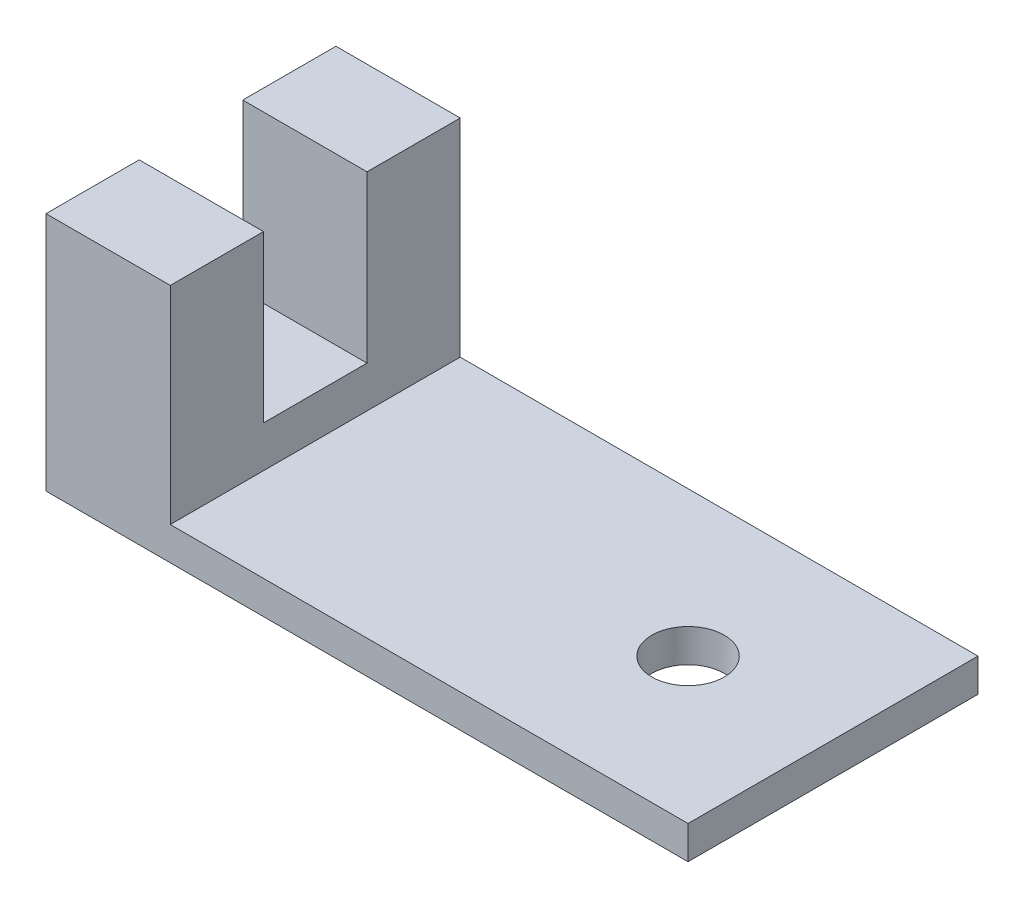
ISO-10303-21;
HEADER;
FILE_DESCRIPTION(('STEP AP214'),'2;1');
FILE_NAME('part.step','',(''),(''),'','','');
FILE_SCHEMA(('AUTOMOTIVE_DESIGN { 1 0 10303 214 1 1 1 1 }'));
ENDSEC;
DATA;
#1=APPLICATION_CONTEXT('core data for automotive mechanical design processes');
#2=APPLICATION_PROTOCOL_DEFINITION('international standard','automotive_design',2000,#1);
#3=PRODUCT_CONTEXT('',#1,'mechanical');
#4=PRODUCT('Part','Part','',(#3));
#5=PRODUCT_RELATED_PRODUCT_CATEGORY('part','',(#4));
#6=PRODUCT_DEFINITION_FORMATION('','',#4);
#7=PRODUCT_DEFINITION_CONTEXT('part definition',#1,'design');
#8=PRODUCT_DEFINITION('design','',#6,#7);
#9=PRODUCT_DEFINITION_SHAPE('','',#8);
#10=(LENGTH_UNIT() NAMED_UNIT(*) SI_UNIT(.MILLI.,.METRE.));
#11=(NAMED_UNIT(*) PLANE_ANGLE_UNIT() SI_UNIT($,.RADIAN.));
#12=(NAMED_UNIT(*) SI_UNIT($,.STERADIAN.) SOLID_ANGLE_UNIT());
#13=UNCERTAINTY_MEASURE_WITH_UNIT(LENGTH_MEASURE(1.E-05),#10,'distance_accuracy_value','');
#14=(GEOMETRIC_REPRESENTATION_CONTEXT(3) GLOBAL_UNCERTAINTY_ASSIGNED_CONTEXT((#13)) GLOBAL_UNIT_ASSIGNED_CONTEXT((#10,
#11,#12)) REPRESENTATION_CONTEXT('',''));
#15=CARTESIAN_POINT('',(0.,0.,0.));
#16=DIRECTION('',(0.,0.,1.));
#17=DIRECTION('',(1.,0.,0.));
#18=AXIS2_PLACEMENT_3D('',#15,#16,#17);
#19=CARTESIAN_POINT('',(0.,1.6,0.));
#20=DIRECTION('',(1.,0.,0.));
#21=DIRECTION('',(0.,0.,-1.));
#22=AXIS2_PLACEMENT_3D('',#19,#20,#21);
#23=PLANE('',#22);
#24=DIRECTION('',(0.,0.,1.));
#25=VECTOR('',#24,1.);
#26=CARTESIAN_POINT('',(0.,0.,0.));
#27=LINE('',#26,#25);
#28=CARTESIAN_POINT('',(0.,0.,-14.));
#29=VERTEX_POINT('',#28);
#30=CARTESIAN_POINT('',(0.,0.,0.));
#31=VERTEX_POINT('',#30);
#32=EDGE_CURVE('E99',#29,#31,#27,.T.);
#33=ORIENTED_EDGE('',*,*,#32,.T.);
#34=DIRECTION('',(0.,-1.,0.));
#35=VECTOR('',#34,1.);
#36=CARTESIAN_POINT('',(0.,1.6,0.));
#37=LINE('',#36,#35);
#38=CARTESIAN_POINT('',(0.,11.6,0.));
#39=VERTEX_POINT('',#38);
#40=EDGE_CURVE('E11',#39,#31,#37,.T.);
#41=ORIENTED_EDGE('',*,*,#40,.F.);
#42=DIRECTION('',(0.,0.,-1.));
#43=VECTOR('',#42,1.);
#44=CARTESIAN_POINT('',(0.,11.6,-4.5));
#45=LINE('',#44,#43);
#46=CARTESIAN_POINT('',(0.,11.6,-4.5));
#47=VERTEX_POINT('',#46);
#48=EDGE_CURVE('E131',#39,#47,#45,.T.);
#49=ORIENTED_EDGE('',*,*,#48,.T.);
#50=DIRECTION('',(0.,-1.,0.));
#51=VECTOR('',#50,1.);
#52=CARTESIAN_POINT('',(0.,3.6,-4.5));
#53=LINE('',#52,#51);
#54=CARTESIAN_POINT('',(0.,3.6,-4.5));
#55=VERTEX_POINT('',#54);
#56=EDGE_CURVE('E190',#47,#55,#53,.T.);
#57=ORIENTED_EDGE('',*,*,#56,.T.);
#58=DIRECTION('',(0.,0.,-1.));
#59=VECTOR('',#58,1.);
#60=CARTESIAN_POINT('',(0.,3.6,-9.5));
#61=LINE('',#60,#59);
#62=CARTESIAN_POINT('',(0.,3.6,-9.5));
#63=VERTEX_POINT('',#62);
#64=EDGE_CURVE('E187',#55,#63,#61,.T.);
#65=ORIENTED_EDGE('',*,*,#64,.T.);
#66=DIRECTION('',(0.,1.,0.));
#67=VECTOR('',#66,1.);
#68=CARTESIAN_POINT('',(0.,11.6,-9.5));
#69=LINE('',#68,#67);
#70=CARTESIAN_POINT('',(0.,11.6,-9.5));
#71=VERTEX_POINT('',#70);
#72=EDGE_CURVE('E185',#63,#71,#69,.T.);
#73=ORIENTED_EDGE('',*,*,#72,.T.);
#74=DIRECTION('',(0.,0.,-1.));
#75=VECTOR('',#74,1.);
#76=CARTESIAN_POINT('',(0.,11.6,-14.));
#77=LINE('',#76,#75);
#78=CARTESIAN_POINT('',(0.,11.6,-14.));
#79=VERTEX_POINT('',#78);
#80=EDGE_CURVE('E102',#71,#79,#77,.T.);
#81=ORIENTED_EDGE('',*,*,#80,.T.);
#82=DIRECTION('',(0.,-1.,0.));
#83=VECTOR('',#82,1.);
#84=CARTESIAN_POINT('',(0.,1.6,-14.));
#85=LINE('',#84,#83);
#86=EDGE_CURVE('E85',#79,#29,#85,.T.);
#87=ORIENTED_EDGE('',*,*,#86,.T.);
#88=EDGE_LOOP('',(#33,#41,#49,#57,#65,#73,#81,#87));
#89=FACE_BOUND('',#88,.T.);
#90=ADVANCED_FACE('F37',(#89),#23,.F.);
#91=CARTESIAN_POINT('',(0.,1.6,0.));
#92=DIRECTION('',(0.,0.,-1.));
#93=DIRECTION('',(-1.,0.,0.));
#94=AXIS2_PLACEMENT_3D('',#91,#92,#93);
#95=PLANE('',#94);
#96=DIRECTION('',(1.,0.,0.));
#97=VECTOR('',#96,1.);
#98=CARTESIAN_POINT('',(0.,0.,0.));
#99=LINE('',#98,#97);
#100=CARTESIAN_POINT('',(31.,0.,0.));
#101=VERTEX_POINT('',#100);
#102=EDGE_CURVE('E106',#31,#101,#99,.T.);
#103=ORIENTED_EDGE('',*,*,#102,.T.);
#104=DIRECTION('',(0.,-1.,0.));
#105=VECTOR('',#104,1.);
#106=CARTESIAN_POINT('',(31.,1.6,0.));
#107=LINE('',#106,#105);
#108=CARTESIAN_POINT('',(31.,1.6,0.));
#109=VERTEX_POINT('',#108);
#110=EDGE_CURVE('E44',#109,#101,#107,.T.);
#111=ORIENTED_EDGE('',*,*,#110,.F.);
#112=DIRECTION('',(1.,0.,0.));
#113=VECTOR('',#112,1.);
#114=CARTESIAN_POINT('',(0.,1.6,0.));
#115=LINE('',#114,#113);
#116=CARTESIAN_POINT('',(6.,1.6,0.));
#117=VERTEX_POINT('',#116);
#118=EDGE_CURVE('E92',#117,#109,#115,.T.);
#119=ORIENTED_EDGE('',*,*,#118,.F.);
#120=DIRECTION('',(0.,1.,0.));
#121=VECTOR('',#120,1.);
#122=CARTESIAN_POINT('',(6.,11.6,0.));
#123=LINE('',#122,#121);
#124=CARTESIAN_POINT('',(6.,11.6,0.));
#125=VERTEX_POINT('',#124);
#126=EDGE_CURVE('E51',#117,#125,#123,.T.);
#127=ORIENTED_EDGE('',*,*,#126,.T.);
#128=DIRECTION('',(-1.,0.,0.));
#129=VECTOR('',#128,1.);
#130=CARTESIAN_POINT('',(6.,11.6,0.));
#131=LINE('',#130,#129);
#132=EDGE_CURVE('E126',#125,#39,#131,.T.);
#133=ORIENTED_EDGE('',*,*,#132,.T.);
#134=ORIENTED_EDGE('',*,*,#40,.T.);
#135=EDGE_LOOP('',(#103,#111,#119,#127,#133,#134));
#136=FACE_BOUND('',#135,.T.);
#137=ADVANCED_FACE('F122',(#136),#95,.F.);
#138=CARTESIAN_POINT('',(31.,1.6,0.));
#139=DIRECTION('',(-1.,0.,0.));
#140=DIRECTION('',(0.,0.,1.));
#141=AXIS2_PLACEMENT_3D('',#138,#139,#140);
#142=PLANE('',#141);
#143=DIRECTION('',(0.,0.,-1.));
#144=VECTOR('',#143,1.);
#145=CARTESIAN_POINT('',(31.,0.,0.));
#146=LINE('',#145,#144);
#147=CARTESIAN_POINT('',(31.,0.,-14.));
#148=VERTEX_POINT('',#147);
#149=EDGE_CURVE('E93',#101,#148,#146,.T.);
#150=ORIENTED_EDGE('',*,*,#149,.T.);
#151=DIRECTION('',(0.,-1.,0.));
#152=VECTOR('',#151,1.);
#153=CARTESIAN_POINT('',(31.,1.6,-14.));
#154=LINE('',#153,#152);
#155=CARTESIAN_POINT('',(31.,1.6,-14.));
#156=VERTEX_POINT('',#155);
#157=EDGE_CURVE('E88',#156,#148,#154,.T.);
#158=ORIENTED_EDGE('',*,*,#157,.F.);
#159=DIRECTION('',(0.,0.,-1.));
#160=VECTOR('',#159,1.);
#161=CARTESIAN_POINT('',(31.,1.6,0.));
#162=LINE('',#161,#160);
#163=EDGE_CURVE('E60',#109,#156,#162,.T.);
#164=ORIENTED_EDGE('',*,*,#163,.F.);
#165=ORIENTED_EDGE('',*,*,#110,.T.);
#166=EDGE_LOOP('',(#150,#158,#164,#165));
#167=FACE_BOUND('',#166,.T.);
#168=ADVANCED_FACE('F119',(#167),#142,.F.);
#169=CARTESIAN_POINT('',(0.,1.6,-14.));
#170=DIRECTION('',(0.,0.,1.));
#171=DIRECTION('',(1.,0.,0.));
#172=AXIS2_PLACEMENT_3D('',#169,#170,#171);
#173=PLANE('',#172);
#174=DIRECTION('',(-1.,0.,0.));
#175=VECTOR('',#174,1.);
#176=CARTESIAN_POINT('',(0.,0.,-14.));
#177=LINE('',#176,#175);
#178=EDGE_CURVE('E80',#148,#29,#177,.T.);
#179=ORIENTED_EDGE('',*,*,#178,.T.);
#180=ORIENTED_EDGE('',*,*,#86,.F.);
#181=DIRECTION('',(-1.,0.,0.));
#182=VECTOR('',#181,1.);
#183=CARTESIAN_POINT('',(6.,11.6,-14.));
#184=LINE('',#183,#182);
#185=CARTESIAN_POINT('',(6.,11.6,-14.));
#186=VERTEX_POINT('',#185);
#187=EDGE_CURVE('E107',#186,#79,#184,.T.);
#188=ORIENTED_EDGE('',*,*,#187,.F.);
#189=DIRECTION('',(0.,-1.,0.));
#190=VECTOR('',#189,1.);
#191=CARTESIAN_POINT('',(6.,1.6,-14.));
#192=LINE('',#191,#190);
#193=CARTESIAN_POINT('',(6.,1.6,-14.));
#194=VERTEX_POINT('',#193);
#195=EDGE_CURVE('E169',#186,#194,#192,.T.);
#196=ORIENTED_EDGE('',*,*,#195,.T.);
#197=DIRECTION('',(-1.,0.,0.));
#198=VECTOR('',#197,1.);
#199=CARTESIAN_POINT('',(0.,1.6,-14.));
#200=LINE('',#199,#198);
#201=EDGE_CURVE('E103',#156,#194,#200,.T.);
#202=ORIENTED_EDGE('',*,*,#201,.F.);
#203=ORIENTED_EDGE('',*,*,#157,.T.);
#204=EDGE_LOOP('',(#179,#180,#188,#196,#202,#203));
#205=FACE_BOUND('',#204,.T.);
#206=ADVANCED_FACE('F82',(#205),#173,.F.);
#207=CARTESIAN_POINT('',(0.,1.6,0.));
#208=DIRECTION('',(0.,-1.,0.));
#209=DIRECTION('',(0.,0.,-1.));
#210=AXIS2_PLACEMENT_3D('',#207,#208,#209);
#211=PLANE('',#210);
#212=CARTESIAN_POINT('',(24.,1.6,-7.));
#213=DIRECTION('',(0.,1.,0.));
#214=DIRECTION('',(0.,0.,1.));
#215=AXIS2_PLACEMENT_3D('',#212,#213,#214);
#216=CIRCLE('',#215,1.75);
#217=CARTESIAN_POINT('',(24.,1.6,-5.25));
#218=VERTEX_POINT('',#217);
#219=EDGE_CURVE('E192',#218,#218,#216,.T.);
#220=ORIENTED_EDGE('',*,*,#219,.F.);
#221=EDGE_LOOP('',(#220));
#222=FACE_BOUND('',#221,.T.);
#223=ORIENTED_EDGE('',*,*,#201,.T.);
#224=DIRECTION('',(0.,0.,1.));
#225=VECTOR('',#224,1.);
#226=CARTESIAN_POINT('',(6.,1.6,0.));
#227=LINE('',#226,#225);
#228=EDGE_CURVE('E166',#194,#117,#227,.T.);
#229=ORIENTED_EDGE('',*,*,#228,.T.);
#230=ORIENTED_EDGE('',*,*,#118,.T.);
#231=ORIENTED_EDGE('',*,*,#163,.T.);
#232=EDGE_LOOP('',(#223,#229,#230,#231));
#233=FACE_BOUND('',#232,.T.);
#234=ADVANCED_FACE('F173',(#222,#233),#211,.F.);
#235=CARTESIAN_POINT('',(0.,0.,0.));
#236=DIRECTION('',(0.,-1.,0.));
#237=DIRECTION('',(0.,0.,-1.));
#238=AXIS2_PLACEMENT_3D('',#235,#236,#237);
#239=PLANE('',#238);
#240=CARTESIAN_POINT('',(24.,0.,-7.));
#241=DIRECTION('',(0.,-1.,0.));
#242=DIRECTION('',(0.,0.,-1.));
#243=AXIS2_PLACEMENT_3D('',#240,#241,#242);
#244=CIRCLE('',#243,1.75);
#245=CARTESIAN_POINT('',(24.,0.,-8.75));
#246=VERTEX_POINT('',#245);
#247=EDGE_CURVE('E207',#246,#246,#244,.F.);
#248=ORIENTED_EDGE('',*,*,#247,.T.);
#249=EDGE_LOOP('',(#248));
#250=FACE_BOUND('',#249,.T.);
#251=ORIENTED_EDGE('',*,*,#32,.F.);
#252=ORIENTED_EDGE('',*,*,#178,.F.);
#253=ORIENTED_EDGE('',*,*,#149,.F.);
#254=ORIENTED_EDGE('',*,*,#102,.F.);
#255=EDGE_LOOP('',(#251,#252,#253,#254));
#256=FACE_BOUND('',#255,.T.);
#257=ADVANCED_FACE('F105',(#250,#256),#239,.T.);
#258=CARTESIAN_POINT('',(6.,11.6,-14.));
#259=DIRECTION('',(0.,1.,0.));
#260=DIRECTION('',(0.,0.,1.));
#261=AXIS2_PLACEMENT_3D('',#258,#259,#260);
#262=PLANE('',#261);
#263=ORIENTED_EDGE('',*,*,#80,.F.);
#264=DIRECTION('',(-1.,0.,0.));
#265=VECTOR('',#264,1.);
#266=CARTESIAN_POINT('',(6.,11.6,-9.5));
#267=LINE('',#266,#265);
#268=CARTESIAN_POINT('',(6.,11.6,-9.5));
#269=VERTEX_POINT('',#268);
#270=EDGE_CURVE('E110',#269,#71,#267,.T.);
#271=ORIENTED_EDGE('',*,*,#270,.F.);
#272=DIRECTION('',(0.,0.,-1.));
#273=VECTOR('',#272,1.);
#274=CARTESIAN_POINT('',(6.,11.6,-14.));
#275=LINE('',#274,#273);
#276=EDGE_CURVE('E171',#269,#186,#275,.T.);
#277=ORIENTED_EDGE('',*,*,#276,.T.);
#278=ORIENTED_EDGE('',*,*,#187,.T.);
#279=EDGE_LOOP('',(#263,#271,#277,#278));
#280=FACE_BOUND('',#279,.T.);
#281=ADVANCED_FACE('F221',(#280),#262,.T.);
#282=CARTESIAN_POINT('',(6.,11.6,-9.5));
#283=DIRECTION('',(0.,0.,1.));
#284=DIRECTION('',(0.,-1.,0.));
#285=AXIS2_PLACEMENT_3D('',#282,#283,#284);
#286=PLANE('',#285);
#287=ORIENTED_EDGE('',*,*,#72,.F.);
#288=DIRECTION('',(-1.,0.,0.));
#289=VECTOR('',#288,1.);
#290=CARTESIAN_POINT('',(6.,3.6,-9.5));
#291=LINE('',#290,#289);
#292=CARTESIAN_POINT('',(6.,3.6,-9.5));
#293=VERTEX_POINT('',#292);
#294=EDGE_CURVE('E181',#293,#63,#291,.T.);
#295=ORIENTED_EDGE('',*,*,#294,.F.);
#296=DIRECTION('',(0.,1.,0.));
#297=VECTOR('',#296,1.);
#298=CARTESIAN_POINT('',(6.,11.6,-9.5));
#299=LINE('',#298,#297);
#300=EDGE_CURVE('E195',#293,#269,#299,.T.);
#301=ORIENTED_EDGE('',*,*,#300,.T.);
#302=ORIENTED_EDGE('',*,*,#270,.T.);
#303=EDGE_LOOP('',(#287,#295,#301,#302));
#304=FACE_BOUND('',#303,.T.);
#305=ADVANCED_FACE('F252',(#304),#286,.T.);
#306=CARTESIAN_POINT('',(6.,3.6,-9.5));
#307=DIRECTION('',(0.,1.,0.));
#308=DIRECTION('',(0.,0.,1.));
#309=AXIS2_PLACEMENT_3D('',#306,#307,#308);
#310=PLANE('',#309);
#311=ORIENTED_EDGE('',*,*,#64,.F.);
#312=DIRECTION('',(-1.,0.,0.));
#313=VECTOR('',#312,1.);
#314=CARTESIAN_POINT('',(6.,3.6,-4.5));
#315=LINE('',#314,#313);
#316=CARTESIAN_POINT('',(6.,3.6,-4.5));
#317=VERTEX_POINT('',#316);
#318=EDGE_CURVE('E179',#317,#55,#315,.T.);
#319=ORIENTED_EDGE('',*,*,#318,.F.);
#320=DIRECTION('',(0.,0.,-1.));
#321=VECTOR('',#320,1.);
#322=CARTESIAN_POINT('',(6.,3.6,-9.5));
#323=LINE('',#322,#321);
#324=EDGE_CURVE('E198',#317,#293,#323,.T.);
#325=ORIENTED_EDGE('',*,*,#324,.T.);
#326=ORIENTED_EDGE('',*,*,#294,.T.);
#327=EDGE_LOOP('',(#311,#319,#325,#326));
#328=FACE_BOUND('',#327,.T.);
#329=ADVANCED_FACE('F263',(#328),#310,.T.);
#330=CARTESIAN_POINT('',(6.,3.6,-4.5));
#331=DIRECTION('',(0.,0.,-1.));
#332=DIRECTION('',(-1.,0.,0.));
#333=AXIS2_PLACEMENT_3D('',#330,#331,#332);
#334=PLANE('',#333);
#335=ORIENTED_EDGE('',*,*,#56,.F.);
#336=DIRECTION('',(-1.,0.,0.));
#337=VECTOR('',#336,1.);
#338=CARTESIAN_POINT('',(6.,11.6,-4.5));
#339=LINE('',#338,#337);
#340=CARTESIAN_POINT('',(6.,11.6,-4.5));
#341=VERTEX_POINT('',#340);
#342=EDGE_CURVE('E177',#341,#47,#339,.T.);
#343=ORIENTED_EDGE('',*,*,#342,.F.);
#344=DIRECTION('',(0.,-1.,0.));
#345=VECTOR('',#344,1.);
#346=CARTESIAN_POINT('',(6.,3.6,-4.5));
#347=LINE('',#346,#345);
#348=EDGE_CURVE('E201',#341,#317,#347,.T.);
#349=ORIENTED_EDGE('',*,*,#348,.T.);
#350=ORIENTED_EDGE('',*,*,#318,.T.);
#351=EDGE_LOOP('',(#335,#343,#349,#350));
#352=FACE_BOUND('',#351,.T.);
#353=ADVANCED_FACE('F274',(#352),#334,.T.);
#354=CARTESIAN_POINT('',(6.,11.6,-4.5));
#355=DIRECTION('',(0.,1.,0.));
#356=DIRECTION('',(0.,0.,1.));
#357=AXIS2_PLACEMENT_3D('',#354,#355,#356);
#358=PLANE('',#357);
#359=ORIENTED_EDGE('',*,*,#48,.F.);
#360=ORIENTED_EDGE('',*,*,#132,.F.);
#361=DIRECTION('',(0.,0.,-1.));
#362=VECTOR('',#361,1.);
#363=CARTESIAN_POINT('',(6.,11.6,-4.5));
#364=LINE('',#363,#362);
#365=EDGE_CURVE('E204',#125,#341,#364,.T.);
#366=ORIENTED_EDGE('',*,*,#365,.T.);
#367=ORIENTED_EDGE('',*,*,#342,.T.);
#368=EDGE_LOOP('',(#359,#360,#366,#367));
#369=FACE_BOUND('',#368,.T.);
#370=ADVANCED_FACE('F285',(#369),#358,.T.);
#371=CARTESIAN_POINT('',(6.,0.,0.));
#372=DIRECTION('',(1.,0.,0.));
#373=DIRECTION('',(0.,0.,-1.));
#374=AXIS2_PLACEMENT_3D('',#371,#372,#373);
#375=PLANE('',#374);
#376=ORIENTED_EDGE('',*,*,#228,.F.);
#377=ORIENTED_EDGE('',*,*,#195,.F.);
#378=ORIENTED_EDGE('',*,*,#276,.F.);
#379=ORIENTED_EDGE('',*,*,#300,.F.);
#380=ORIENTED_EDGE('',*,*,#324,.F.);
#381=ORIENTED_EDGE('',*,*,#348,.F.);
#382=ORIENTED_EDGE('',*,*,#365,.F.);
#383=ORIENTED_EDGE('',*,*,#126,.F.);
#384=EDGE_LOOP('',(#376,#377,#378,#379,#380,#381,#382,#383));
#385=FACE_BOUND('',#384,.T.);
#386=ADVANCED_FACE('F167',(#385),#375,.T.);
#387=CARTESIAN_POINT('',(24.,-0.000999999999999916,-7.));
#388=DIRECTION('',(0.,1.,0.));
#389=DIRECTION('',(0.,0.,1.));
#390=AXIS2_PLACEMENT_3D('',#387,#388,#389);
#391=CYLINDRICAL_SURFACE('',#390,1.75);
#392=ORIENTED_EDGE('',*,*,#247,.F.);
#393=EDGE_LOOP('',(#392));
#394=FACE_BOUND('',#393,.T.);
#395=ORIENTED_EDGE('',*,*,#219,.T.);
#396=EDGE_LOOP('',(#395));
#397=FACE_BOUND('',#396,.T.);
#398=ADVANCED_FACE('F213',(#394,#397),#391,.F.);
#399=CLOSED_SHELL('',(#90,#137,#168,#206,#234,#257,#281,#305,#329,#353,#370,#386,#398));
#400=MANIFOLD_SOLID_BREP('B2',#399);
#401=ADVANCED_BREP_SHAPE_REPRESENTATION('',(#18,#400),#14);
#402=SHAPE_DEFINITION_REPRESENTATION(#9,#401);
ENDSEC;
END-ISO-10303-21;
